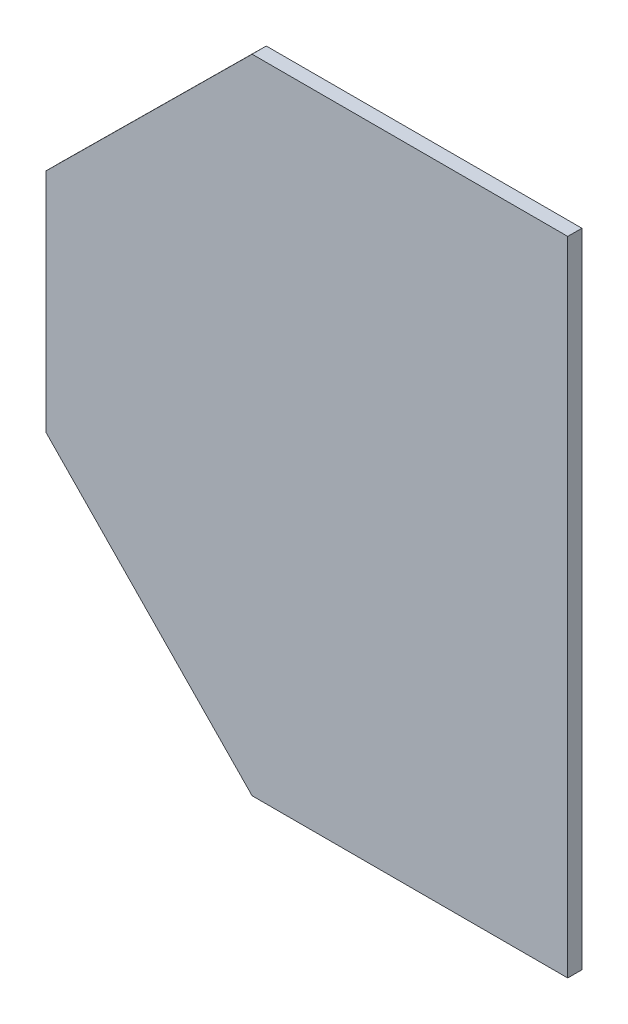
ISO-10303-21;
HEADER;
FILE_DESCRIPTION(('STEP AP214'),'2;1');
FILE_NAME('part.step','',(''),(''),'','','');
FILE_SCHEMA(('AUTOMOTIVE_DESIGN { 1 0 10303 214 1 1 1 1 }'));
ENDSEC;
DATA;
#1=APPLICATION_CONTEXT('core data for automotive mechanical design processes');
#2=APPLICATION_PROTOCOL_DEFINITION('international standard','automotive_design',2000,#1);
#3=PRODUCT_CONTEXT('',#1,'mechanical');
#4=PRODUCT('Part','Part','',(#3));
#5=PRODUCT_RELATED_PRODUCT_CATEGORY('part','',(#4));
#6=PRODUCT_DEFINITION_FORMATION('','',#4);
#7=PRODUCT_DEFINITION_CONTEXT('part definition',#1,'design');
#8=PRODUCT_DEFINITION('design','',#6,#7);
#9=PRODUCT_DEFINITION_SHAPE('','',#8);
#10=(LENGTH_UNIT() NAMED_UNIT(*) SI_UNIT(.MILLI.,.METRE.));
#11=(NAMED_UNIT(*) PLANE_ANGLE_UNIT() SI_UNIT($,.RADIAN.));
#12=(NAMED_UNIT(*) SI_UNIT($,.STERADIAN.) SOLID_ANGLE_UNIT());
#13=UNCERTAINTY_MEASURE_WITH_UNIT(LENGTH_MEASURE(1.E-05),#10,'distance_accuracy_value','');
#14=(GEOMETRIC_REPRESENTATION_CONTEXT(3) GLOBAL_UNCERTAINTY_ASSIGNED_CONTEXT((#13)) GLOBAL_UNIT_ASSIGNED_CONTEXT((#10,
#11,#12)) REPRESENTATION_CONTEXT('',''));
#15=CARTESIAN_POINT('',(0.,0.,0.));
#16=DIRECTION('',(0.,0.,1.));
#17=DIRECTION('',(1.,0.,0.));
#18=AXIS2_PLACEMENT_3D('',#15,#16,#17);
#19=CARTESIAN_POINT('',(-4.28095093104508,285.009681153562,9.525));
#20=DIRECTION('',(-1.,0.,0.));
#21=DIRECTION('',(0.,-1.,0.));
#22=AXIS2_PLACEMENT_3D('',#19,#20,#21);
#23=PLANE('',#22);
#24=DIRECTION('',(0.,1.,0.));
#25=VECTOR('',#24,1.);
#26=CARTESIAN_POINT('',(-4.28095093104508,285.009681153562,0.));
#27=LINE('',#26,#25);
#28=CARTESIAN_POINT('',(-4.28095093104503,-146.790318846438,0.));
#29=VERTEX_POINT('',#28);
#30=CARTESIAN_POINT('',(-4.28095093104508,285.009681153562,0.));
#31=VERTEX_POINT('',#30);
#32=EDGE_CURVE('E121',#29,#31,#27,.T.);
#33=ORIENTED_EDGE('',*,*,#32,.T.);
#34=DIRECTION('',(0.,0.,-1.));
#35=VECTOR('',#34,1.);
#36=CARTESIAN_POINT('',(-4.28095093104508,285.009681153562,9.525));
#37=LINE('',#36,#35);
#38=CARTESIAN_POINT('',(-4.28095093104508,285.009681153562,9.525));
#39=VERTEX_POINT('',#38);
#40=EDGE_CURVE('E11',#39,#31,#37,.T.);
#41=ORIENTED_EDGE('',*,*,#40,.F.);
#42=DIRECTION('',(0.,1.,0.));
#43=VECTOR('',#42,1.);
#44=CARTESIAN_POINT('',(-4.28095093104508,285.009681153562,9.525));
#45=LINE('',#44,#43);
#46=CARTESIAN_POINT('',(-4.28095093104503,-146.790318846438,9.525));
#47=VERTEX_POINT('',#46);
#48=EDGE_CURVE('E131',#47,#39,#45,.T.);
#49=ORIENTED_EDGE('',*,*,#48,.F.);
#50=DIRECTION('',(0.,0.,-1.));
#51=VECTOR('',#50,1.);
#52=CARTESIAN_POINT('',(-4.28095093104503,-146.790318846438,9.525));
#53=LINE('',#52,#51);
#54=EDGE_CURVE('E117',#47,#29,#53,.T.);
#55=ORIENTED_EDGE('',*,*,#54,.T.);
#56=EDGE_LOOP('',(#33,#41,#49,#55));
#57=FACE_BOUND('',#56,.T.);
#58=ADVANCED_FACE('F37',(#57),#23,.F.);
#59=CARTESIAN_POINT('',(-216.488062196188,285.009681153562,9.525));
#60=DIRECTION('',(0.,-1.,0.));
#61=DIRECTION('',(0.,0.,-1.));
#62=AXIS2_PLACEMENT_3D('',#59,#60,#61);
#63=PLANE('',#62);
#64=DIRECTION('',(-1.,0.,0.));
#65=VECTOR('',#64,1.);
#66=CARTESIAN_POINT('',(-216.488062196188,285.009681153562,0.));
#67=LINE('',#66,#65);
#68=CARTESIAN_POINT('',(-216.488062196188,285.009681153562,0.));
#69=VERTEX_POINT('',#68);
#70=EDGE_CURVE('E124',#31,#69,#67,.T.);
#71=ORIENTED_EDGE('',*,*,#70,.T.);
#72=DIRECTION('',(0.,0.,-1.));
#73=VECTOR('',#72,1.);
#74=CARTESIAN_POINT('',(-216.488062196188,285.009681153562,9.525));
#75=LINE('',#74,#73);
#76=CARTESIAN_POINT('',(-216.488062196188,285.009681153562,9.525));
#77=VERTEX_POINT('',#76);
#78=EDGE_CURVE('E45',#77,#69,#75,.T.);
#79=ORIENTED_EDGE('',*,*,#78,.F.);
#80=DIRECTION('',(-1.,0.,0.));
#81=VECTOR('',#80,1.);
#82=CARTESIAN_POINT('',(-216.488062196188,285.009681153562,9.525));
#83=LINE('',#82,#81);
#84=EDGE_CURVE('E90',#39,#77,#83,.T.);
#85=ORIENTED_EDGE('',*,*,#84,.F.);
#86=ORIENTED_EDGE('',*,*,#40,.T.);
#87=EDGE_LOOP('',(#71,#79,#85,#86));
#88=FACE_BOUND('',#87,.T.);
#89=ADVANCED_FACE('F155',(#88),#63,.F.);
#90=CARTESIAN_POINT('',(-216.488062196188,285.009681153562,9.525));
#91=DIRECTION('',(0.703672127062564,-0.710524832497251,0.));
#92=DIRECTION('',(0.710524832497251,0.703672127062564,0.));
#93=AXIS2_PLACEMENT_3D('',#90,#91,#92);
#94=PLANE('',#93);
#95=DIRECTION('',(-0.710524832497251,-0.703672127062564,0.));
#96=VECTOR('',#95,1.);
#97=CARTESIAN_POINT('',(-216.488062196188,285.009681153562,0.));
#98=LINE('',#97,#96);
#99=CARTESIAN_POINT('',(-354.995654442996,147.837934871207,0.));
#100=VERTEX_POINT('',#99);
#101=EDGE_CURVE('E126',#69,#100,#98,.T.);
#102=ORIENTED_EDGE('',*,*,#101,.T.);
#103=DIRECTION('',(0.,0.,-1.));
#104=VECTOR('',#103,1.);
#105=CARTESIAN_POINT('',(-354.995654442996,147.837934871207,9.525));
#106=LINE('',#105,#104);
#107=CARTESIAN_POINT('',(-354.995654442996,147.837934871207,9.525));
#108=VERTEX_POINT('',#107);
#109=EDGE_CURVE('E112',#108,#100,#106,.T.);
#110=ORIENTED_EDGE('',*,*,#109,.F.);
#111=DIRECTION('',(-0.710524832497251,-0.703672127062564,0.));
#112=VECTOR('',#111,1.);
#113=CARTESIAN_POINT('',(-216.488062196188,285.009681153562,9.525));
#114=LINE('',#113,#112);
#115=EDGE_CURVE('E103',#77,#108,#114,.T.);
#116=ORIENTED_EDGE('',*,*,#115,.F.);
#117=ORIENTED_EDGE('',*,*,#78,.T.);
#118=EDGE_LOOP('',(#102,#110,#116,#117));
#119=FACE_BOUND('',#118,.T.);
#120=ADVANCED_FACE('F137',(#119),#94,.F.);
#121=CARTESIAN_POINT('',(-354.995654442996,147.837934871207,9.525));
#122=DIRECTION('',(1.,0.,0.));
#123=DIRECTION('',(0.,0.,-1.));
#124=AXIS2_PLACEMENT_3D('',#121,#122,#123);
#125=PLANE('',#124);
#126=DIRECTION('',(0.,-1.,0.));
#127=VECTOR('',#126,1.);
#128=CARTESIAN_POINT('',(-354.995654442996,147.837934871207,0.));
#129=LINE('',#128,#127);
#130=CARTESIAN_POINT('',(-354.995654442996,-4.56206512879289,0.));
#131=VERTEX_POINT('',#130);
#132=EDGE_CURVE('E111',#100,#131,#129,.T.);
#133=ORIENTED_EDGE('',*,*,#132,.T.);
#134=DIRECTION('',(0.,0.,-1.));
#135=VECTOR('',#134,1.);
#136=CARTESIAN_POINT('',(-354.995654442996,-4.56206512879289,9.525));
#137=LINE('',#136,#135);
#138=CARTESIAN_POINT('',(-354.995654442996,-4.56206512879289,9.525));
#139=VERTEX_POINT('',#138);
#140=EDGE_CURVE('E108',#139,#131,#137,.T.);
#141=ORIENTED_EDGE('',*,*,#140,.F.);
#142=DIRECTION('',(0.,-1.,0.));
#143=VECTOR('',#142,1.);
#144=CARTESIAN_POINT('',(-354.995654442996,147.837934871207,9.525));
#145=LINE('',#144,#143);
#146=EDGE_CURVE('E97',#108,#139,#145,.T.);
#147=ORIENTED_EDGE('',*,*,#146,.F.);
#148=ORIENTED_EDGE('',*,*,#109,.T.);
#149=EDGE_LOOP('',(#133,#141,#147,#148));
#150=FACE_BOUND('',#149,.T.);
#151=ADVANCED_FACE('F109',(#150),#125,.F.);
#152=CARTESIAN_POINT('',(-354.995654442996,-4.56206512879289,9.525));
#153=DIRECTION('',(0.716415326023721,0.697674050426362,0.));
#154=DIRECTION('',(-0.697674050426362,0.716415326023721,0.));
#155=AXIS2_PLACEMENT_3D('',#152,#153,#154);
#156=PLANE('',#155);
#157=DIRECTION('',(0.697674050426362,-0.716415326023721,0.));
#158=VECTOR('',#157,1.);
#159=CARTESIAN_POINT('',(-354.995654442996,-4.56206512879289,0.));
#160=LINE('',#159,#158);
#161=CARTESIAN_POINT('',(-216.488062196188,-146.790318846438,0.));
#162=VERTEX_POINT('',#161);
#163=EDGE_CURVE('E76',#131,#162,#160,.T.);
#164=ORIENTED_EDGE('',*,*,#163,.T.);
#165=DIRECTION('',(0.,0.,-1.));
#166=VECTOR('',#165,1.);
#167=CARTESIAN_POINT('',(-216.488062196188,-146.790318846438,9.525));
#168=LINE('',#167,#166);
#169=CARTESIAN_POINT('',(-216.488062196188,-146.790318846438,9.525));
#170=VERTEX_POINT('',#169);
#171=EDGE_CURVE('E113',#170,#162,#168,.T.);
#172=ORIENTED_EDGE('',*,*,#171,.F.);
#173=DIRECTION('',(0.697674050426362,-0.716415326023721,0.));
#174=VECTOR('',#173,1.);
#175=CARTESIAN_POINT('',(-354.995654442996,-4.56206512879289,9.525));
#176=LINE('',#175,#174);
#177=EDGE_CURVE('E101',#139,#170,#176,.T.);
#178=ORIENTED_EDGE('',*,*,#177,.F.);
#179=ORIENTED_EDGE('',*,*,#140,.T.);
#180=EDGE_LOOP('',(#164,#172,#178,#179));
#181=FACE_BOUND('',#180,.T.);
#182=ADVANCED_FACE('F115',(#181),#156,.F.);
#183=CARTESIAN_POINT('',(-4.28095093104503,-146.790318846438,9.525));
#184=DIRECTION('',(0.,1.,0.));
#185=DIRECTION('',(-1.,0.,0.));
#186=AXIS2_PLACEMENT_3D('',#183,#184,#185);
#187=PLANE('',#186);
#188=DIRECTION('',(1.,0.,0.));
#189=VECTOR('',#188,1.);
#190=CARTESIAN_POINT('',(-4.28095093104503,-146.790318846438,0.));
#191=LINE('',#190,#189);
#192=EDGE_CURVE('E82',#162,#29,#191,.T.);
#193=ORIENTED_EDGE('',*,*,#192,.T.);
#194=ORIENTED_EDGE('',*,*,#54,.F.);
#195=DIRECTION('',(1.,0.,0.));
#196=VECTOR('',#195,1.);
#197=CARTESIAN_POINT('',(-4.28095093104503,-146.790318846438,9.525));
#198=LINE('',#197,#196);
#199=EDGE_CURVE('E53',#170,#47,#198,.T.);
#200=ORIENTED_EDGE('',*,*,#199,.F.);
#201=ORIENTED_EDGE('',*,*,#171,.T.);
#202=EDGE_LOOP('',(#193,#194,#200,#201));
#203=FACE_BOUND('',#202,.T.);
#204=ADVANCED_FACE('F144',(#203),#187,.F.);
#205=CARTESIAN_POINT('',(0.,0.,9.525));
#206=DIRECTION('',(0.,0.,-1.));
#207=DIRECTION('',(-1.,0.,0.));
#208=AXIS2_PLACEMENT_3D('',#205,#206,#207);
#209=PLANE('',#208);
#210=ORIENTED_EDGE('',*,*,#48,.T.);
#211=ORIENTED_EDGE('',*,*,#84,.T.);
#212=ORIENTED_EDGE('',*,*,#115,.T.);
#213=ORIENTED_EDGE('',*,*,#146,.T.);
#214=ORIENTED_EDGE('',*,*,#177,.T.);
#215=ORIENTED_EDGE('',*,*,#199,.T.);
#216=EDGE_LOOP('',(#210,#211,#212,#213,#214,#215));
#217=FACE_BOUND('',#216,.T.);
#218=ADVANCED_FACE('F99',(#217),#209,.F.);
#219=CARTESIAN_POINT('',(0.,0.,0.));
#220=DIRECTION('',(0.,0.,-1.));
#221=DIRECTION('',(-1.,0.,0.));
#222=AXIS2_PLACEMENT_3D('',#219,#220,#221);
#223=PLANE('',#222);
#224=ORIENTED_EDGE('',*,*,#32,.F.);
#225=ORIENTED_EDGE('',*,*,#192,.F.);
#226=ORIENTED_EDGE('',*,*,#163,.F.);
#227=ORIENTED_EDGE('',*,*,#132,.F.);
#228=ORIENTED_EDGE('',*,*,#101,.F.);
#229=ORIENTED_EDGE('',*,*,#70,.F.);
#230=EDGE_LOOP('',(#224,#225,#226,#227,#228,#229));
#231=FACE_BOUND('',#230,.T.);
#232=ADVANCED_FACE('F140',(#231),#223,.T.);
#233=CLOSED_SHELL('',(#58,#89,#120,#151,#182,#204,#218,#232));
#234=MANIFOLD_SOLID_BREP('B2',#233);
#235=ADVANCED_BREP_SHAPE_REPRESENTATION('',(#18,#234),#14);
#236=SHAPE_DEFINITION_REPRESENTATION(#9,#235);
ENDSEC;
END-ISO-10303-21;
